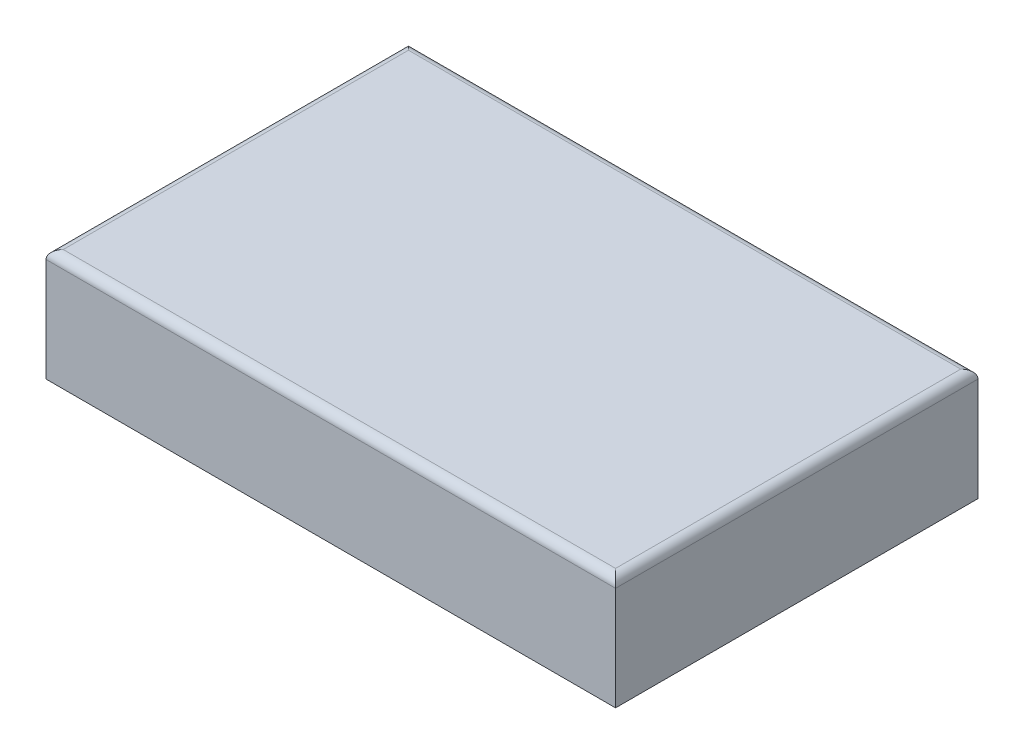
ISO-10303-21;
HEADER;
FILE_DESCRIPTION(('STEP AP214'),'2;1');
FILE_NAME('part.step','',(''),(''),'','','');
FILE_SCHEMA(('AUTOMOTIVE_DESIGN { 1 0 10303 214 1 1 1 1 }'));
ENDSEC;
DATA;
#1=APPLICATION_CONTEXT('core data for automotive mechanical design processes');
#2=APPLICATION_PROTOCOL_DEFINITION('international standard','automotive_design',2000,#1);
#3=PRODUCT_CONTEXT('',#1,'mechanical');
#4=PRODUCT('Part','Part','',(#3));
#5=PRODUCT_RELATED_PRODUCT_CATEGORY('part','',(#4));
#6=PRODUCT_DEFINITION_FORMATION('','',#4);
#7=PRODUCT_DEFINITION_CONTEXT('part definition',#1,'design');
#8=PRODUCT_DEFINITION('design','',#6,#7);
#9=PRODUCT_DEFINITION_SHAPE('','',#8);
#10=(LENGTH_UNIT() NAMED_UNIT(*) SI_UNIT(.MILLI.,.METRE.));
#11=(NAMED_UNIT(*) PLANE_ANGLE_UNIT() SI_UNIT($,.RADIAN.));
#12=(NAMED_UNIT(*) SI_UNIT($,.STERADIAN.) SOLID_ANGLE_UNIT());
#13=UNCERTAINTY_MEASURE_WITH_UNIT(LENGTH_MEASURE(1.E-05),#10,'distance_accuracy_value','');
#14=(GEOMETRIC_REPRESENTATION_CONTEXT(3) GLOBAL_UNCERTAINTY_ASSIGNED_CONTEXT((#13)) GLOBAL_UNIT_ASSIGNED_CONTEXT((#10,
#11,#12)) REPRESENTATION_CONTEXT('',''));
#15=CARTESIAN_POINT('',(0.,0.,0.));
#16=DIRECTION('',(0.,0.,1.));
#17=DIRECTION('',(1.,0.,0.));
#18=AXIS2_PLACEMENT_3D('',#15,#16,#17);
#19=CARTESIAN_POINT('',(0.,0.,0.));
#20=DIRECTION('',(0.,1.,0.));
#21=DIRECTION('',(0.,0.,1.));
#22=AXIS2_PLACEMENT_3D('',#19,#20,#21);
#23=PLANE('',#22);
#24=DIRECTION('',(0.,0.,-1.));
#25=VECTOR('',#24,1.);
#26=CARTESIAN_POINT('',(33.,0.,-21.));
#27=LINE('',#26,#25);
#28=CARTESIAN_POINT('',(33.,0.,21.));
#29=VERTEX_POINT('',#28);
#30=CARTESIAN_POINT('',(33.,0.,-21.));
#31=VERTEX_POINT('',#30);
#32=EDGE_CURVE('E148',#29,#31,#27,.T.);
#33=ORIENTED_EDGE('',*,*,#32,.F.);
#34=DIRECTION('',(1.,0.,0.));
#35=VECTOR('',#34,1.);
#36=CARTESIAN_POINT('',(-33.,0.,21.));
#37=LINE('',#36,#35);
#38=CARTESIAN_POINT('',(-33.,0.,21.));
#39=VERTEX_POINT('',#38);
#40=EDGE_CURVE('E165',#39,#29,#37,.T.);
#41=ORIENTED_EDGE('',*,*,#40,.F.);
#42=DIRECTION('',(0.,0.,1.));
#43=VECTOR('',#42,1.);
#44=CARTESIAN_POINT('',(-33.,0.,-21.));
#45=LINE('',#44,#43);
#46=CARTESIAN_POINT('',(-33.,0.,-21.));
#47=VERTEX_POINT('',#46);
#48=EDGE_CURVE('E161',#47,#39,#45,.T.);
#49=ORIENTED_EDGE('',*,*,#48,.F.);
#50=DIRECTION('',(-1.,0.,0.));
#51=VECTOR('',#50,1.);
#52=CARTESIAN_POINT('',(-33.,0.,-21.));
#53=LINE('',#52,#51);
#54=EDGE_CURVE('E157',#31,#47,#53,.T.);
#55=ORIENTED_EDGE('',*,*,#54,.F.);
#56=EDGE_LOOP('',(#33,#41,#49,#55));
#57=FACE_BOUND('',#56,.T.);
#58=DIRECTION('',(0.,0.,-1.));
#59=VECTOR('',#58,1.);
#60=CARTESIAN_POINT('',(30.,0.,-18.));
#61=LINE('',#60,#59);
#62=CARTESIAN_POINT('',(30.,0.,18.));
#63=VERTEX_POINT('',#62);
#64=CARTESIAN_POINT('',(30.,0.,-18.));
#65=VERTEX_POINT('',#64);
#66=EDGE_CURVE('E216',#63,#65,#61,.T.);
#67=ORIENTED_EDGE('',*,*,#66,.T.);
#68=DIRECTION('',(-1.,0.,0.));
#69=VECTOR('',#68,1.);
#70=CARTESIAN_POINT('',(-30.,0.,-18.));
#71=LINE('',#70,#69);
#72=CARTESIAN_POINT('',(-30.,0.,-18.));
#73=VERTEX_POINT('',#72);
#74=EDGE_CURVE('E222',#65,#73,#71,.T.);
#75=ORIENTED_EDGE('',*,*,#74,.T.);
#76=DIRECTION('',(0.,0.,1.));
#77=VECTOR('',#76,1.);
#78=CARTESIAN_POINT('',(-30.,0.,-18.));
#79=LINE('',#78,#77);
#80=CARTESIAN_POINT('',(-30.,0.,18.));
#81=VERTEX_POINT('',#80);
#82=EDGE_CURVE('E141',#73,#81,#79,.T.);
#83=ORIENTED_EDGE('',*,*,#82,.T.);
#84=DIRECTION('',(1.,0.,0.));
#85=VECTOR('',#84,1.);
#86=CARTESIAN_POINT('',(-30.,0.,18.));
#87=LINE('',#86,#85);
#88=EDGE_CURVE('E232',#81,#63,#87,.T.);
#89=ORIENTED_EDGE('',*,*,#88,.T.);
#90=EDGE_LOOP('',(#67,#75,#83,#89));
#91=FACE_BOUND('',#90,.T.);
#92=ADVANCED_FACE('F39',(#57,#91),#23,.F.);
#93=CARTESIAN_POINT('',(33.,10.,-21.));
#94=DIRECTION('',(-1.,0.,0.));
#95=DIRECTION('',(0.,0.,1.));
#96=AXIS2_PLACEMENT_3D('',#93,#94,#95);
#97=PLANE('',#96);
#98=DIRECTION('',(0.,-1.,0.));
#99=VECTOR('',#98,1.);
#100=CARTESIAN_POINT('',(33.,10.,-21.));
#101=LINE('',#100,#99);
#102=CARTESIAN_POINT('',(33.,12.,-21.));
#103=VERTEX_POINT('',#102);
#104=EDGE_CURVE('E178',#103,#31,#101,.T.);
#105=ORIENTED_EDGE('',*,*,#104,.F.);
#106=DIRECTION('',(0.,0.,-1.));
#107=VECTOR('',#106,1.);
#108=CARTESIAN_POINT('',(33.,12.,21.));
#109=LINE('',#108,#107);
#110=CARTESIAN_POINT('',(33.,12.,21.));
#111=VERTEX_POINT('',#110);
#112=EDGE_CURVE('E64',#103,#111,#109,.F.);
#113=ORIENTED_EDGE('',*,*,#112,.T.);
#114=DIRECTION('',(0.,-1.,0.));
#115=VECTOR('',#114,1.);
#116=CARTESIAN_POINT('',(33.,10.,21.));
#117=LINE('',#116,#115);
#118=EDGE_CURVE('E169',#111,#29,#117,.T.);
#119=ORIENTED_EDGE('',*,*,#118,.T.);
#120=ORIENTED_EDGE('',*,*,#32,.T.);
#121=EDGE_LOOP('',(#105,#113,#119,#120));
#122=FACE_BOUND('',#121,.T.);
#123=ADVANCED_FACE('F257',(#122),#97,.F.);
#124=CARTESIAN_POINT('',(-33.,10.,-21.));
#125=DIRECTION('',(0.,0.,1.));
#126=DIRECTION('',(1.,0.,0.));
#127=AXIS2_PLACEMENT_3D('',#124,#125,#126);
#128=PLANE('',#127);
#129=DIRECTION('',(0.,-1.,0.));
#130=VECTOR('',#129,1.);
#131=CARTESIAN_POINT('',(-33.,10.,-21.));
#132=LINE('',#131,#130);
#133=CARTESIAN_POINT('',(-33.,12.,-21.));
#134=VERTEX_POINT('',#133);
#135=EDGE_CURVE('E175',#134,#47,#132,.T.);
#136=ORIENTED_EDGE('',*,*,#135,.F.);
#137=DIRECTION('',(-1.,0.,0.));
#138=VECTOR('',#137,1.);
#139=CARTESIAN_POINT('',(33.,12.,-21.));
#140=LINE('',#139,#138);
#141=EDGE_CURVE('E194',#134,#103,#140,.F.);
#142=ORIENTED_EDGE('',*,*,#141,.T.);
#143=ORIENTED_EDGE('',*,*,#104,.T.);
#144=ORIENTED_EDGE('',*,*,#54,.T.);
#145=EDGE_LOOP('',(#136,#142,#143,#144));
#146=FACE_BOUND('',#145,.T.);
#147=ADVANCED_FACE('F262',(#146),#128,.F.);
#148=CARTESIAN_POINT('',(-33.,10.,-21.));
#149=DIRECTION('',(1.,0.,0.));
#150=DIRECTION('',(0.,0.,-1.));
#151=AXIS2_PLACEMENT_3D('',#148,#149,#150);
#152=PLANE('',#151);
#153=DIRECTION('',(0.,-1.,0.));
#154=VECTOR('',#153,1.);
#155=CARTESIAN_POINT('',(-33.,10.,21.));
#156=LINE('',#155,#154);
#157=CARTESIAN_POINT('',(-33.,12.,21.));
#158=VERTEX_POINT('',#157);
#159=EDGE_CURVE('E172',#158,#39,#156,.T.);
#160=ORIENTED_EDGE('',*,*,#159,.F.);
#161=DIRECTION('',(0.,0.,1.));
#162=VECTOR('',#161,1.);
#163=CARTESIAN_POINT('',(-33.,12.,-21.));
#164=LINE('',#163,#162);
#165=EDGE_CURVE('E11',#158,#134,#164,.F.);
#166=ORIENTED_EDGE('',*,*,#165,.T.);
#167=ORIENTED_EDGE('',*,*,#135,.T.);
#168=ORIENTED_EDGE('',*,*,#48,.T.);
#169=EDGE_LOOP('',(#160,#166,#167,#168));
#170=FACE_BOUND('',#169,.T.);
#171=ADVANCED_FACE('F253',(#170),#152,.F.);
#172=CARTESIAN_POINT('',(-33.,10.,21.));
#173=DIRECTION('',(0.,0.,-1.));
#174=DIRECTION('',(-1.,0.,0.));
#175=AXIS2_PLACEMENT_3D('',#172,#173,#174);
#176=PLANE('',#175);
#177=ORIENTED_EDGE('',*,*,#118,.F.);
#178=DIRECTION('',(1.,0.,0.));
#179=VECTOR('',#178,1.);
#180=CARTESIAN_POINT('',(-33.,12.,21.));
#181=LINE('',#180,#179);
#182=EDGE_CURVE('E49',#111,#158,#181,.F.);
#183=ORIENTED_EDGE('',*,*,#182,.T.);
#184=ORIENTED_EDGE('',*,*,#159,.T.);
#185=ORIENTED_EDGE('',*,*,#40,.T.);
#186=EDGE_LOOP('',(#177,#183,#184,#185));
#187=FACE_BOUND('',#186,.T.);
#188=ADVANCED_FACE('F246',(#187),#176,.F.);
#189=CARTESIAN_POINT('',(30.,10.,-18.));
#190=DIRECTION('',(-1.,0.,0.));
#191=DIRECTION('',(0.,0.,1.));
#192=AXIS2_PLACEMENT_3D('',#189,#190,#191);
#193=PLANE('',#192);
#194=ORIENTED_EDGE('',*,*,#66,.F.);
#195=DIRECTION('',(0.,-1.,0.));
#196=VECTOR('',#195,1.);
#197=CARTESIAN_POINT('',(30.,10.,18.));
#198=LINE('',#197,#196);
#199=CARTESIAN_POINT('',(30.,10.,18.));
#200=VERTEX_POINT('',#199);
#201=EDGE_CURVE('E150',#200,#63,#198,.T.);
#202=ORIENTED_EDGE('',*,*,#201,.F.);
#203=DIRECTION('',(0.,0.,-1.));
#204=VECTOR('',#203,1.);
#205=CARTESIAN_POINT('',(30.,10.,-18.));
#206=LINE('',#205,#204);
#207=CARTESIAN_POINT('',(30.,10.,-18.));
#208=VERTEX_POINT('',#207);
#209=EDGE_CURVE('E137',#200,#208,#206,.T.);
#210=ORIENTED_EDGE('',*,*,#209,.T.);
#211=DIRECTION('',(0.,-1.,0.));
#212=VECTOR('',#211,1.);
#213=CARTESIAN_POINT('',(30.,10.,-18.));
#214=LINE('',#213,#212);
#215=EDGE_CURVE('E135',#208,#65,#214,.T.);
#216=ORIENTED_EDGE('',*,*,#215,.T.);
#217=EDGE_LOOP('',(#194,#202,#210,#216));
#218=FACE_BOUND('',#217,.T.);
#219=ADVANCED_FACE('F242',(#218),#193,.T.);
#220=CARTESIAN_POINT('',(-30.,10.,-18.));
#221=DIRECTION('',(0.,0.,1.));
#222=DIRECTION('',(1.,0.,0.));
#223=AXIS2_PLACEMENT_3D('',#220,#221,#222);
#224=PLANE('',#223);
#225=ORIENTED_EDGE('',*,*,#74,.F.);
#226=ORIENTED_EDGE('',*,*,#215,.F.);
#227=DIRECTION('',(-1.,0.,0.));
#228=VECTOR('',#227,1.);
#229=CARTESIAN_POINT('',(-30.,10.,-18.));
#230=LINE('',#229,#228);
#231=CARTESIAN_POINT('',(-30.,10.,-18.));
#232=VERTEX_POINT('',#231);
#233=EDGE_CURVE('E120',#208,#232,#230,.T.);
#234=ORIENTED_EDGE('',*,*,#233,.T.);
#235=DIRECTION('',(0.,-1.,0.));
#236=VECTOR('',#235,1.);
#237=CARTESIAN_POINT('',(-30.,10.,-18.));
#238=LINE('',#237,#236);
#239=EDGE_CURVE('E132',#232,#73,#238,.T.);
#240=ORIENTED_EDGE('',*,*,#239,.T.);
#241=EDGE_LOOP('',(#225,#226,#234,#240));
#242=FACE_BOUND('',#241,.T.);
#243=ADVANCED_FACE('F131',(#242),#224,.T.);
#244=CARTESIAN_POINT('',(-30.,10.,-18.));
#245=DIRECTION('',(1.,0.,0.));
#246=DIRECTION('',(0.,0.,-1.));
#247=AXIS2_PLACEMENT_3D('',#244,#245,#246);
#248=PLANE('',#247);
#249=ORIENTED_EDGE('',*,*,#82,.F.);
#250=ORIENTED_EDGE('',*,*,#239,.F.);
#251=DIRECTION('',(0.,0.,1.));
#252=VECTOR('',#251,1.);
#253=CARTESIAN_POINT('',(-30.,10.,-18.));
#254=LINE('',#253,#252);
#255=CARTESIAN_POINT('',(-30.,10.,18.));
#256=VERTEX_POINT('',#255);
#257=EDGE_CURVE('E117',#232,#256,#254,.T.);
#258=ORIENTED_EDGE('',*,*,#257,.T.);
#259=DIRECTION('',(0.,-1.,0.));
#260=VECTOR('',#259,1.);
#261=CARTESIAN_POINT('',(-30.,10.,18.));
#262=LINE('',#261,#260);
#263=EDGE_CURVE('E144',#256,#81,#262,.T.);
#264=ORIENTED_EDGE('',*,*,#263,.T.);
#265=EDGE_LOOP('',(#249,#250,#258,#264));
#266=FACE_BOUND('',#265,.T.);
#267=ADVANCED_FACE('F139',(#266),#248,.T.);
#268=CARTESIAN_POINT('',(-30.,10.,18.));
#269=DIRECTION('',(0.,0.,-1.));
#270=DIRECTION('',(-1.,0.,0.));
#271=AXIS2_PLACEMENT_3D('',#268,#269,#270);
#272=PLANE('',#271);
#273=ORIENTED_EDGE('',*,*,#88,.F.);
#274=ORIENTED_EDGE('',*,*,#263,.F.);
#275=DIRECTION('',(1.,0.,0.));
#276=VECTOR('',#275,1.);
#277=CARTESIAN_POINT('',(-30.,10.,18.));
#278=LINE('',#277,#276);
#279=EDGE_CURVE('E123',#256,#200,#278,.T.);
#280=ORIENTED_EDGE('',*,*,#279,.T.);
#281=ORIENTED_EDGE('',*,*,#201,.T.);
#282=EDGE_LOOP('',(#273,#274,#280,#281));
#283=FACE_BOUND('',#282,.T.);
#284=ADVANCED_FACE('F240',(#283),#272,.T.);
#285=CARTESIAN_POINT('',(0.,10.,0.));
#286=DIRECTION('',(0.,1.,0.));
#287=DIRECTION('',(0.,0.,1.));
#288=AXIS2_PLACEMENT_3D('',#285,#286,#287);
#289=PLANE('',#288);
#290=ORIENTED_EDGE('',*,*,#233,.F.);
#291=ORIENTED_EDGE('',*,*,#209,.F.);
#292=ORIENTED_EDGE('',*,*,#279,.F.);
#293=ORIENTED_EDGE('',*,*,#257,.F.);
#294=EDGE_LOOP('',(#290,#291,#292,#293));
#295=FACE_BOUND('',#294,.T.);
#296=ADVANCED_FACE('F119',(#295),#289,.F.);
#297=CARTESIAN_POINT('',(0.,13.,0.));
#298=DIRECTION('',(0.,1.,0.));
#299=DIRECTION('',(0.,0.,1.));
#300=AXIS2_PLACEMENT_3D('',#297,#298,#299);
#301=PLANE('',#300);
#302=DIRECTION('',(0.,0.,-1.));
#303=VECTOR('',#302,1.);
#304=CARTESIAN_POINT('',(32.,13.,-21.));
#305=LINE('',#304,#303);
#306=CARTESIAN_POINT('',(32.,13.,20.));
#307=VERTEX_POINT('',#306);
#308=CARTESIAN_POINT('',(32.,13.,-20.));
#309=VERTEX_POINT('',#308);
#310=EDGE_CURVE('E187',#307,#309,#305,.T.);
#311=ORIENTED_EDGE('',*,*,#310,.T.);
#312=DIRECTION('',(-1.,0.,0.));
#313=VECTOR('',#312,1.);
#314=CARTESIAN_POINT('',(-33.,13.,-20.));
#315=LINE('',#314,#313);
#316=CARTESIAN_POINT('',(-32.,13.,-20.));
#317=VERTEX_POINT('',#316);
#318=EDGE_CURVE('E190',#309,#317,#315,.T.);
#319=ORIENTED_EDGE('',*,*,#318,.T.);
#320=DIRECTION('',(0.,0.,1.));
#321=VECTOR('',#320,1.);
#322=CARTESIAN_POINT('',(-32.,13.,21.));
#323=LINE('',#322,#321);
#324=CARTESIAN_POINT('',(-32.,13.,20.));
#325=VERTEX_POINT('',#324);
#326=EDGE_CURVE('E181',#317,#325,#323,.T.);
#327=ORIENTED_EDGE('',*,*,#326,.T.);
#328=DIRECTION('',(1.,0.,0.));
#329=VECTOR('',#328,1.);
#330=CARTESIAN_POINT('',(33.,13.,20.));
#331=LINE('',#330,#329);
#332=EDGE_CURVE('E184',#325,#307,#331,.T.);
#333=ORIENTED_EDGE('',*,*,#332,.T.);
#334=EDGE_LOOP('',(#311,#319,#327,#333));
#335=FACE_BOUND('',#334,.T.);
#336=ADVANCED_FACE('F283',(#335),#301,.T.);
#337=CARTESIAN_POINT('',(0.,12.,20.));
#338=DIRECTION('',(-1.,0.,0.));
#339=DIRECTION('',(0.,0.,1.));
#340=AXIS2_PLACEMENT_3D('',#337,#338,#339);
#341=CYLINDRICAL_SURFACE('',#340,1.);
#342=CARTESIAN_POINT('',(-32.,12.,20.));
#343=DIRECTION('',(-0.707106781186547,0.,-0.707106781186547));
#344=DIRECTION('',(0.707106781186547,0.,-0.707106781186547));
#345=AXIS2_PLACEMENT_3D('',#342,#343,#344);
#346=ELLIPSE('',#345,1.41421356237309,1.);
#347=EDGE_CURVE('E207',#158,#325,#346,.T.);
#348=ORIENTED_EDGE('',*,*,#347,.F.);
#349=ORIENTED_EDGE('',*,*,#182,.F.);
#350=CARTESIAN_POINT('',(32.,12.,20.));
#351=DIRECTION('',(-0.707106781186547,0.,0.707106781186547));
#352=DIRECTION('',(-0.707106781186547,0.,-0.707106781186547));
#353=AXIS2_PLACEMENT_3D('',#350,#351,#352);
#354=ELLIPSE('',#353,1.41421356237309,1.);
#355=EDGE_CURVE('E43',#307,#111,#354,.F.);
#356=ORIENTED_EDGE('',*,*,#355,.F.);
#357=ORIENTED_EDGE('',*,*,#332,.F.);
#358=EDGE_LOOP('',(#348,#349,#356,#357));
#359=FACE_BOUND('',#358,.T.);
#360=ADVANCED_FACE('F41',(#359),#341,.T.);
#361=CARTESIAN_POINT('',(32.,12.,0.));
#362=DIRECTION('',(0.,0.,1.));
#363=DIRECTION('',(1.,0.,0.));
#364=AXIS2_PLACEMENT_3D('',#361,#362,#363);
#365=CYLINDRICAL_SURFACE('',#364,1.);
#366=ORIENTED_EDGE('',*,*,#355,.T.);
#367=ORIENTED_EDGE('',*,*,#112,.F.);
#368=CARTESIAN_POINT('',(32.,12.,-20.));
#369=DIRECTION('',(0.707106781186547,0.,0.707106781186547));
#370=DIRECTION('',(-0.707106781186547,0.,0.707106781186547));
#371=AXIS2_PLACEMENT_3D('',#368,#369,#370);
#372=ELLIPSE('',#371,1.41421356237309,1.);
#373=EDGE_CURVE('E205',#309,#103,#372,.F.);
#374=ORIENTED_EDGE('',*,*,#373,.F.);
#375=ORIENTED_EDGE('',*,*,#310,.F.);
#376=EDGE_LOOP('',(#366,#367,#374,#375));
#377=FACE_BOUND('',#376,.T.);
#378=ADVANCED_FACE('F278',(#377),#365,.T.);
#379=CARTESIAN_POINT('',(-32.,12.,0.));
#380=DIRECTION('',(0.,0.,-1.));
#381=DIRECTION('',(-1.,0.,0.));
#382=AXIS2_PLACEMENT_3D('',#379,#380,#381);
#383=CYLINDRICAL_SURFACE('',#382,1.);
#384=ORIENTED_EDGE('',*,*,#347,.T.);
#385=ORIENTED_EDGE('',*,*,#326,.F.);
#386=CARTESIAN_POINT('',(-32.,12.,-20.));
#387=DIRECTION('',(0.707106781186547,0.,-0.707106781186547));
#388=DIRECTION('',(-0.707106781186547,0.,-0.707106781186547));
#389=AXIS2_PLACEMENT_3D('',#386,#387,#388);
#390=ELLIPSE('',#389,1.41421356237309,1.);
#391=EDGE_CURVE('E202',#134,#317,#390,.T.);
#392=ORIENTED_EDGE('',*,*,#391,.F.);
#393=ORIENTED_EDGE('',*,*,#165,.F.);
#394=EDGE_LOOP('',(#384,#385,#392,#393));
#395=FACE_BOUND('',#394,.T.);
#396=ADVANCED_FACE('F275',(#395),#383,.T.);
#397=CARTESIAN_POINT('',(0.,12.,-20.));
#398=DIRECTION('',(1.,0.,0.));
#399=DIRECTION('',(0.,0.,-1.));
#400=AXIS2_PLACEMENT_3D('',#397,#398,#399);
#401=CYLINDRICAL_SURFACE('',#400,1.);
#402=ORIENTED_EDGE('',*,*,#373,.T.);
#403=ORIENTED_EDGE('',*,*,#141,.F.);
#404=ORIENTED_EDGE('',*,*,#391,.T.);
#405=ORIENTED_EDGE('',*,*,#318,.F.);
#406=EDGE_LOOP('',(#402,#403,#404,#405));
#407=FACE_BOUND('',#406,.T.);
#408=ADVANCED_FACE('F272',(#407),#401,.T.);
#409=CLOSED_SHELL('',(#92,#123,#147,#171,#188,#219,#243,#267,#284,#296,#336,#360,#378,#396,#408));
#410=MANIFOLD_SOLID_BREP('B2',#409);
#411=ADVANCED_BREP_SHAPE_REPRESENTATION('',(#18,#410),#14);
#412=SHAPE_DEFINITION_REPRESENTATION(#9,#411);
ENDSEC;
END-ISO-10303-21;
